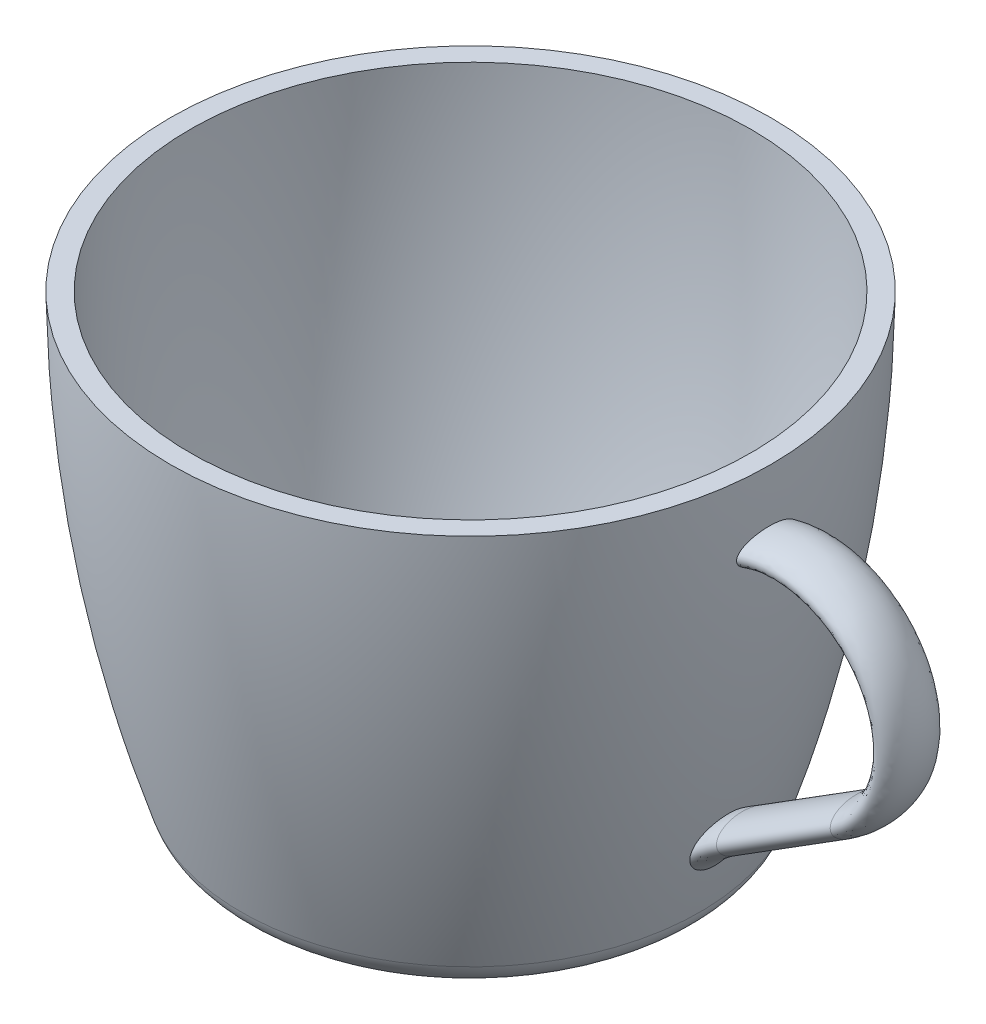
ISO-10303-21;
HEADER;
FILE_DESCRIPTION(('STEP AP214'),'2;1');
FILE_NAME('part.step','',(''),(''),'','','');
FILE_SCHEMA(('AUTOMOTIVE_DESIGN { 1 0 10303 214 1 1 1 1 }'));
ENDSEC;
DATA;
#1=APPLICATION_CONTEXT('core data for automotive mechanical design processes');
#2=APPLICATION_PROTOCOL_DEFINITION('international standard','automotive_design',2000,#1);
#3=PRODUCT_CONTEXT('',#1,'mechanical');
#4=PRODUCT('Part','Part','',(#3));
#5=PRODUCT_RELATED_PRODUCT_CATEGORY('part','',(#4));
#6=PRODUCT_DEFINITION_FORMATION('','',#4);
#7=PRODUCT_DEFINITION_CONTEXT('part definition',#1,'design');
#8=PRODUCT_DEFINITION('design','',#6,#7);
#9=PRODUCT_DEFINITION_SHAPE('','',#8);
#10=(LENGTH_UNIT() NAMED_UNIT(*) SI_UNIT(.MILLI.,.METRE.));
#11=(NAMED_UNIT(*) PLANE_ANGLE_UNIT() SI_UNIT($,.RADIAN.));
#12=(NAMED_UNIT(*) SI_UNIT($,.STERADIAN.) SOLID_ANGLE_UNIT());
#13=UNCERTAINTY_MEASURE_WITH_UNIT(LENGTH_MEASURE(1.E-05),#10,'distance_accuracy_value','');
#14=(GEOMETRIC_REPRESENTATION_CONTEXT(3) GLOBAL_UNCERTAINTY_ASSIGNED_CONTEXT((#13)) GLOBAL_UNIT_ASSIGNED_CONTEXT((#10,
#11,#12)) REPRESENTATION_CONTEXT('',''));
#15=CARTESIAN_POINT('',(0.,0.,0.));
#16=DIRECTION('',(0.,0.,1.));
#17=DIRECTION('',(1.,0.,0.));
#18=AXIS2_PLACEMENT_3D('',#15,#16,#17);
#19=CARTESIAN_POINT('',(0.,24.7080802430362,0.));
#20=DIRECTION('',(0.,-1.,0.));
#21=DIRECTION('',(0.,0.,-1.));
#22=AXIS2_PLACEMENT_3D('',#19,#20,#21);
#23=DEGENERATE_TOROIDAL_SURFACE('',#22,112.982951367078,143.,.F.);
#24=CARTESIAN_POINT('',(29.5676970278248,15.4879803064064,-3.));
#25=CARTESIAN_POINT('',(29.5646722833151,15.4413930119851,-2.99999347500467));
#26=CARTESIAN_POINT('',(29.5620379588384,15.3947247860376,-2.99586473990367));
#27=CARTESIAN_POINT('',(29.5576196413952,15.302744468671,-2.97958425291915));
#28=CARTESIAN_POINT('',(29.5558369873295,15.2574346168433,-2.96741993945269));
#29=CARTESIAN_POINT('',(29.5530905095124,15.169638050827,-2.93613071047937));
#30=CARTESIAN_POINT('',(29.5521213389152,15.1271346210882,-2.91705244587597));
#31=CARTESIAN_POINT('',(29.5508707472349,15.0452325327698,-2.87316929618347));
#32=CARTESIAN_POINT('',(29.5505895072274,15.0058346942767,-2.84836290523082));
#33=CARTESIAN_POINT('',(29.5505744102349,14.9047827300416,-2.77592680250168));
#34=CARTESIAN_POINT('',(29.5513386923821,14.8460734630384,-2.72419969958141));
#35=CARTESIAN_POINT('',(29.5538341250121,14.7371446110929,-2.61236780923148));
#36=CARTESIAN_POINT('',(29.5555693077515,14.6869615771577,-2.55222887295512));
#37=CARTESIAN_POINT('',(29.5593456388092,14.5995399590262,-2.43387485870161));
#38=CARTESIAN_POINT('',(29.5613272347704,14.5614738272851,-2.37625795624733));
#39=CARTESIAN_POINT('',(29.5655048965915,14.4904924058887,-2.25811129281611));
#40=CARTESIAN_POINT('',(29.5677005849127,14.4575683061623,-2.19758675161386));
#41=CARTESIAN_POINT('',(29.5721689645029,14.3960645764906,-2.07419306633094));
#42=CARTESIAN_POINT('',(29.5744418435629,14.3674966320324,-2.01131816032832));
#43=CARTESIAN_POINT('',(29.5789553299531,14.3142807891249,-1.88390962397263));
#44=CARTESIAN_POINT('',(29.5811959202585,14.2896348944839,-1.81937516517294));
#45=CARTESIAN_POINT('',(29.5875604603961,14.2229181893074,-1.62951285198764));
#46=CARTESIAN_POINT('',(29.5915340177925,14.1855101232157,-1.50253173681046));
#47=CARTESIAN_POINT('',(29.5987077727412,14.1214568400834,-1.24586224602552));
#48=CARTESIAN_POINT('',(29.6019074557455,14.0948187761417,-1.1161721311129));
#49=CARTESIAN_POINT('',(29.6073363920475,14.0510117052194,-0.854933639413126));
#50=CARTESIAN_POINT('',(29.6095637049861,14.0338616133857,-0.723382083005148));
#51=CARTESIAN_POINT('',(29.6129233924809,14.0083611388011,-0.459470882362938));
#52=CARTESIAN_POINT('',(29.6140560840368,14.0000082083512,-0.327111483258518));
#53=CARTESIAN_POINT('',(29.6152258319325,13.9913765300045,-0.0504204049962542));
#54=CARTESIAN_POINT('',(29.6151572960381,13.9918759785073,0.0939362924642104));
#55=CARTESIAN_POINT('',(29.6136661518723,14.0028934586276,0.382321850431675));
#56=CARTESIAN_POINT('',(29.6122430237262,14.0134153367233,0.5263505637886));
#57=CARTESIAN_POINT('',(29.6081221597564,14.0449908323278,0.81308864498302));
#58=CARTESIAN_POINT('',(29.605425777191,14.0660332696196,0.955799249952536));
#59=CARTESIAN_POINT('',(29.5989278636082,14.119738963004,1.23895351705578));
#60=CARTESIAN_POINT('',(29.5951272178649,14.1523929149665,1.37939890036083));
#61=CARTESIAN_POINT('',(29.5886630285339,14.2132164433989,1.59298488740369));
#62=CARTESIAN_POINT('',(29.5862752688587,14.2365974206366,1.66750801292362));
#63=CARTESIAN_POINT('',(29.581352626978,14.2878198890949,1.81499061236483));
#64=CARTESIAN_POINT('',(29.5788177957126,14.3156598417012,1.88795061584686));
#65=CARTESIAN_POINT('',(29.5737205395251,14.3762882661332,2.03149291454271));
#66=CARTESIAN_POINT('',(29.5711582475447,14.4090584779543,2.10208285433281));
#67=CARTESIAN_POINT('',(29.5661561785859,14.4803598187855,2.24026174571965));
#68=CARTESIAN_POINT('',(29.563716299058,14.5188860143987,2.30785320356433));
#69=CARTESIAN_POINT('',(29.5593600881766,14.5994714024441,2.43374819746498));
#70=CARTESIAN_POINT('',(29.5574179193606,14.6410307527736,2.49236622696259));
#71=CARTESIAN_POINT('',(29.5540884745892,14.7308701554476,2.60445687051399));
#72=CARTESIAN_POINT('',(29.5527020989816,14.7791609431202,2.65792103010208));
#73=CARTESIAN_POINT('',(29.5508446462943,14.8842116626752,2.75790589473511));
#74=CARTESIAN_POINT('',(29.5503881426998,14.9410916519095,2.80430565312633));
#75=CARTESIAN_POINT('',(29.5507994644105,15.0322985423586,2.86479300564279));
#76=CARTESIAN_POINT('',(29.5511180743833,15.0636353046105,2.88341754027651));
#77=CARTESIAN_POINT('',(29.5521825372189,15.1281601176925,2.91707711412985));
#78=CARTESIAN_POINT('',(29.5529280471575,15.1613466633196,2.9321150207327));
#79=CARTESIAN_POINT('',(29.5551593064393,15.2382008538669,2.96139834727733));
#80=CARTESIAN_POINT('',(29.5567873652999,15.2823454669821,2.97441518842387));
#81=CARTESIAN_POINT('',(29.560863323466,15.3721506868468,2.99282313281943));
#82=CARTESIAN_POINT('',(29.5633106916007,15.4178102941685,2.99821916495819));
#83=CARTESIAN_POINT('',(29.5689865668202,15.5093599457868,3.00103201710109));
#84=CARTESIAN_POINT('',(29.5722156448116,15.5552501343871,2.99844298907379));
#85=CARTESIAN_POINT('',(29.5793231511552,15.6459024395874,2.98566461717814));
#86=CARTESIAN_POINT('',(29.583202035633,15.6906637382019,2.97546991709912));
#87=CARTESIAN_POINT('',(29.5925223781922,15.7896213472358,2.94483127598959));
#88=CARTESIAN_POINT('',(29.5981057437856,15.8431809652134,2.92238938178227));
#89=CARTESIAN_POINT('',(29.6096878560013,15.9459164473821,2.86914978019951));
#90=CARTESIAN_POINT('',(29.6156874444777,15.9950829379443,2.8383347473181));
#91=CARTESIAN_POINT('',(29.630952463179,16.1129121907255,2.75298994238722));
#92=CARTESIAN_POINT('',(29.6403114202263,16.1786059268869,2.69441213609493));
#93=CARTESIAN_POINT('',(29.6587768066822,16.3003282013356,2.56804002878115));
#94=CARTESIAN_POINT('',(29.6678827463395,16.3563389607245,2.5002291744676));
#95=CARTESIAN_POINT('',(29.6843045492524,16.4527499733888,2.36832887520475));
#96=CARTESIAN_POINT('',(29.6916934307607,16.4942378941767,2.30502959969608));
#97=CARTESIAN_POINT('',(29.7059444785722,16.571718081227,2.17508034837354));
#98=CARTESIAN_POINT('',(29.7128063327847,16.6077071034863,2.10842842528857));
#99=CARTESIAN_POINT('',(29.7286400483933,16.6886427646486,1.94457253145746));
#100=CARTESIAN_POINT('',(29.7373111305488,16.7311398243536,1.84613166706394));
#101=CARTESIAN_POINT('',(29.753325606647,16.8076041230412,1.64587524570078));
#102=CARTESIAN_POINT('',(29.7606680841252,16.8415654803751,1.54405741617311));
#103=CARTESIAN_POINT('',(29.7758060626793,16.9102662536547,1.30932618521424));
#104=CARTESIAN_POINT('',(29.7831550604662,16.9425724246865,1.17567226328003));
#105=CARTESIAN_POINT('',(29.7954764144929,16.995961673264,0.905921725077907));
#106=CARTESIAN_POINT('',(29.8004459983006,17.0170316619335,0.769822450105882));
#107=CARTESIAN_POINT('',(29.8079946249586,17.0488118643221,0.494885451549243));
#108=CARTESIAN_POINT('',(29.8105474710723,17.0594086040761,0.356034012037504));
#109=CARTESIAN_POINT('',(29.8131506289004,17.0702130997085,0.0778304826705672));
#110=CARTESIAN_POINT('',(29.8131995157516,17.0704149404312,-0.0615218471129423));
#111=CARTESIAN_POINT('',(29.8107922106274,17.0604253612404,-0.339728857432147));
#112=CARTESIAN_POINT('',(29.8083378718171,17.0502416298794,-0.478583829853054));
#113=CARTESIAN_POINT('',(29.8009467957421,17.0191538702516,-0.754956660087094));
#114=CARTESIAN_POINT('',(29.7960118238729,16.9982574656773,-0.892475398013819));
#115=CARTESIAN_POINT('',(29.786056023006,16.9551557366798,-1.11310986378134));
#116=CARTESIAN_POINT('',(29.7817864689749,16.9364923004234,-1.19696196424548));
#117=CARTESIAN_POINT('',(29.7723400675315,16.8945160604558,-1.3633440134956));
#118=CARTESIAN_POINT('',(29.7671643590781,16.8712090882597,-1.44587548173547));
#119=CARTESIAN_POINT('',(29.7559194781808,16.8195210831347,-1.60943023815226));
#120=CARTESIAN_POINT('',(29.7498488501039,16.7911317670715,-1.6904508222638));
#121=CARTESIAN_POINT('',(29.7368602826289,16.7288122602673,-1.85027655489544));
#122=CARTESIAN_POINT('',(29.7299424700233,16.6948828984165,-1.92908203277078));
#123=CARTESIAN_POINT('',(29.717337734778,16.631039065945,-2.06236336492544));
#124=CARTESIAN_POINT('',(29.7118367634939,16.6025937275223,-2.1175606910496));
#125=CARTESIAN_POINT('',(29.70046056797,16.5421479513811,-2.22592657599595));
#126=CARTESIAN_POINT('',(29.694585461468,16.51014862974,-2.27909576471855));
#127=CARTESIAN_POINT('',(29.6825250895645,16.4422991434549,-2.38272066969652));
#128=CARTESIAN_POINT('',(29.6763405883508,16.4064582389907,-2.43318248990326));
#129=CARTESIAN_POINT('',(29.6637294836004,16.3304702921035,-2.53068703390513));
#130=CARTESIAN_POINT('',(29.6573030862129,16.2903268647872,-2.57773257325561));
#131=CARTESIAN_POINT('',(29.6443640529491,16.2055538163148,-2.666996683846));
#132=CARTESIAN_POINT('',(29.6378523672722,16.16095846732,-2.7092474806818));
#133=CARTESIAN_POINT('',(29.6248671141298,16.0666399390527,-2.78775540382967));
#134=CARTESIAN_POINT('',(29.6183935804402,16.0169127786068,-2.82400781907339));
#135=CARTESIAN_POINT('',(29.6056576857807,15.9114402119078,-2.88875374928772));
#136=CARTESIAN_POINT('',(29.5993996219217,15.8556194536343,-2.91712993070481));
#137=CARTESIAN_POINT('',(29.5905653336253,15.7686331653565,-2.9511229332888));
#138=CARTESIAN_POINT('',(29.5877163568612,15.7391393436675,-2.96101739881545));
#139=CARTESIAN_POINT('',(29.5822535605793,15.6792610563528,-2.97763894739098));
#140=CARTESIAN_POINT('',(29.5796395258004,15.6488774405415,-2.98436895424501));
#141=CARTESIAN_POINT('',(29.5754390883009,15.5967027606817,-2.99288058103276));
#142=CARTESIAN_POINT('',(29.5737790804091,15.5750581248191,-2.99554002937028));
#143=CARTESIAN_POINT('',(29.5706164629549,15.5316083847098,-2.99910158753801));
#144=CARTESIAN_POINT('',(29.5691139109809,15.5098032248517,-3.00000305650806));
#145=CARTESIAN_POINT('',(29.5676970278248,15.4879803064064,-3.));
#146=B_SPLINE_CURVE_WITH_KNOTS('',3,(#24,#25,#26,#27,#28,#29,#30,#31,#32,#33,#34,#35,#36,#37,
#38,#39,#40,#41,#42,#43,#44,#45,#46,#47,#48,#49,#50,#51,#52,#53,#54,#55,#56,#57,#58,#59,#60,#61,
#62,#63,#64,#65,#66,#67,#68,#69,#70,#71,#72,#73,#74,#75,#76,#77,#78,#79,#80,#81,#82,#83,#84,#85,
#86,#87,#88,#89,#90,#91,#92,#93,#94,#95,#96,#97,#98,#99,#100,#101,#102,#103,#104,#105,#106,#107,
#108,#109,#110,#111,#112,#113,#114,#115,#116,#117,#118,#119,#120,#121,#122,#123,#124,#125,#126,
#127,#128,#129,#130,#131,#132,#133,#134,#135,#136,#137,#138,#139,#140,#141,#142,#143,#144,#145),
.UNSPECIFIED.,.T.,.F.,(4,2,2,2,2,2,2,2,2,2,2,2,2,2,2,2,2,2,2,2,2,2,2,2,2,2,2,2,2,2,2,2,2,2,2,2,
2,2,2,2,2,2,2,2,2,2,2,2,2,2,2,2,2,2,2,2,2,2,2,2,4),(0.,0.139970521792622,0.280160371341673,
0.419421403776079,0.558719088220218,0.792120171621531,1.02649786808077,1.2334528908751,
1.44004934368447,1.64719059927977,1.85443734765623,2.25110789238997,2.64804146221855,
3.04576353007628,3.4433703840755,3.87609088640544,4.30897752818079,4.74140511524913,
5.17348698257659,5.40779741695436,5.64202717365734,5.87540985826388,6.10859364836367,
6.32383757511008,6.53942878714927,6.75837364914004,6.86754897629111,6.97663672681738,
7.11416281828852,7.25159992158879,7.38913770381803,7.52677243705431,7.70081872031015,
7.87522791524983,8.13928635493102,8.40382459803894,8.63163976429356,8.85958881248374,
9.18179555552028,9.50422371479059,9.91672878521011,10.329713333314,10.747124917178,
11.1647740240074,11.5821141649288,11.999157716448,12.2570695321836,12.5146594719865,
12.7726731149576,13.0306481897807,13.2175513479034,13.4043959768588,13.5907999341719,
13.7770484793263,13.9619600616173,14.1470161892481,14.3346968968841,14.4282721505082,
14.5217607744487,14.5873033738012,14.652869861827),.UNSPECIFIED.);
#147=CARTESIAN_POINT('',(29.5676970278248,15.4879803064064,-3.));
#148=VERTEX_POINT('',#147);
#149=EDGE_CURVE('E79',#148,#148,#146,.T.);
#150=ORIENTED_EDGE('',*,*,#149,.T.);
#151=EDGE_LOOP('',(#150));
#152=FACE_BOUND('',#151,.T.);
#153=CARTESIAN_POINT('',(24.9657021767809,-12.29982733705,-3.));
#154=CARTESIAN_POINT('',(24.9350345345137,-12.4134760592307,-2.99999646246255));
#155=CARTESIAN_POINT('',(24.9051905615634,-12.5273718634481,-2.99134197550601));
#156=CARTESIAN_POINT('',(24.8477211118185,-12.7532295546217,-2.95725053077125));
#157=CARTESIAN_POINT('',(24.8200972198492,-12.8651900160415,-2.93180170149655));
#158=CARTESIAN_POINT('',(24.7630618268586,-13.1032670236771,-2.85957219303458));
#159=CARTESIAN_POINT('',(24.7341183826207,-13.2286370827356,-2.80994543791396));
#160=CARTESIAN_POINT('',(24.6800458728877,-13.4707817829708,-2.69141413156365));
#161=CARTESIAN_POINT('',(24.6549188691458,-13.5875517607098,-2.62249921704464));
#162=CARTESIAN_POINT('',(24.6066544612833,-13.8189891649302,-2.46175111071961));
#163=CARTESIAN_POINT('',(24.5838315612476,-13.9327599760572,-2.36853644827809));
#164=CARTESIAN_POINT('',(24.5424350807943,-14.1454531993017,-2.16560335485954));
#165=CARTESIAN_POINT('',(24.5238633632383,-14.244369095513,-2.0558777235723));
#166=CARTESIAN_POINT('',(24.4981530748163,-14.3848809225125,-1.8752787996805));
#167=CARTESIAN_POINT('',(24.4896209553586,-14.4322968698483,-1.80903439660762));
#168=CARTESIAN_POINT('',(24.4737034815523,-14.5218977988554,-1.6729637078005));
#169=CARTESIAN_POINT('',(24.466318209844,-14.5640824035188,-1.60313716442376));
#170=CARTESIAN_POINT('',(24.445840571586,-14.682379600595,-1.38892494824104));
#171=CARTESIAN_POINT('',(24.4344167197756,-14.7502893479372,-1.23973731480481));
#172=CARTESIAN_POINT('',(24.4151876205229,-14.8662237096352,-0.921797338827574));
#173=CARTESIAN_POINT('',(24.4076887571595,-14.9125399138245,-0.752405797950164));
#174=CARTESIAN_POINT('',(24.3973753616429,-14.976619003147,-0.408151809491478));
#175=CARTESIAN_POINT('',(24.3945610359703,-14.9943806296778,-0.233289121104281));
#176=CARTESIAN_POINT('',(24.3935364461566,-15.0008212964253,0.117971250798729));
#177=CARTESIAN_POINT('',(24.3953520399501,-14.989336999696,0.294372047785685));
#178=CARTESIAN_POINT('',(24.4036923129447,-14.9373030963502,0.64270222047403));
#179=CARTESIAN_POINT('',(24.4102172147191,-14.8967521159723,0.814631384437286));
#180=CARTESIAN_POINT('',(24.4281534810872,-14.7877698480295,1.14919997628708));
#181=CARTESIAN_POINT('',(24.4395637387031,-14.7193448766324,1.31184149921363));
#182=CARTESIAN_POINT('',(24.4605175617565,-14.5974284336284,1.54521448491662));
#183=CARTESIAN_POINT('',(24.4681475526137,-14.5535448235358,1.62128239783381));
#184=CARTESIAN_POINT('',(24.4847250930653,-14.4596590657255,1.76939358767195));
#185=CARTESIAN_POINT('',(24.4936726309506,-14.4096569723841,1.84143690035208));
#186=CARTESIAN_POINT('',(24.5225761249629,-14.2509729909979,2.05036006585586));
#187=CARTESIAN_POINT('',(24.5446242525607,-14.133425557628,2.18039388322379));
#188=CARTESIAN_POINT('',(24.59476533783,-13.8775930827902,2.41685263098332));
#189=CARTESIAN_POINT('',(24.6228555135255,-13.7393175941143,2.52328838112378));
#190=CARTESIAN_POINT('',(24.6686328128695,-13.5243688281918,2.65821667244257));
#191=CARTESIAN_POINT('',(24.6838918220152,-13.4541126438789,2.69802874030228));
#192=CARTESIAN_POINT('',(24.7157663479911,-13.310472867904,2.77085869477862));
#193=CARTESIAN_POINT('',(24.7323811573876,-13.2370909166489,2.80388009338696));
#194=CARTESIAN_POINT('',(24.766925798989,-13.0877941873665,2.86262834560373));
#195=CARTESIAN_POINT('',(24.7848550183707,-13.0118805985625,2.88835857172441));
#196=CARTESIAN_POINT('',(24.8219458940308,-12.8581865771247,2.93211330531708));
#197=CARTESIAN_POINT('',(24.8411074005692,-12.7804063720282,2.95013874700048));
#198=CARTESIAN_POINT('',(24.8959455467507,-12.5625341281959,2.98901928422886));
#199=CARTESIAN_POINT('',(24.9328643482279,-12.4210799337561,3.0011493087873));
#200=CARTESIAN_POINT('',(25.009184870884,-12.1391932609717,2.99867794081787));
#201=CARTESIAN_POINT('',(25.0485852512228,-11.9987602758373,2.98409086636976));
#202=CARTESIAN_POINT('',(25.1254879839079,-11.7336590606725,2.93068913538003));
#203=CARTESIAN_POINT('',(25.1629167279981,-11.6085911046935,2.89373578658115));
#204=CARTESIAN_POINT('',(25.2373509044623,-11.3666470972783,2.79872670227883));
#205=CARTESIAN_POINT('',(25.2743563401037,-11.249770982578,2.74067112976529));
#206=CARTESIAN_POINT('',(25.3470377880501,-11.0256683692752,2.60499215547821));
#207=CARTESIAN_POINT('',(25.382694435092,-10.9185636618795,2.52715828570561));
#208=CARTESIAN_POINT('',(25.451045980996,-10.7174209420049,2.35508782396665));
#209=CARTESIAN_POINT('',(25.4837400111391,-10.6233867578677,2.2608464443889));
#210=CARTESIAN_POINT('',(25.5478479843319,-10.4420801938916,2.05015228149089));
#211=CARTESIAN_POINT('',(25.5789057428367,-10.3560990599782,1.93248264234646));
#212=CARTESIAN_POINT('',(25.6354232673702,-10.2018156312965,1.68487831217168));
#213=CARTESIAN_POINT('',(25.660880484122,-10.1335213848204,1.55493807406444));
#214=CARTESIAN_POINT('',(25.7082440146384,-10.0077313704278,1.26975254578274));
#215=CARTESIAN_POINT('',(25.7293438454122,-9.95255366317838,1.1133504149228));
#216=CARTESIAN_POINT('',(25.763074178452,-9.864909890376,0.793432210582464));
#217=CARTESIAN_POINT('',(25.7757004355697,-9.83245520840624,0.629912614962771));
#218=CARTESIAN_POINT('',(25.7930410136466,-9.78796227016745,0.281861625973422));
#219=CARTESIAN_POINT('',(25.7967666028546,-9.77847394927817,0.0969509476681655));
#220=CARTESIAN_POINT('',(25.7933314591209,-9.78725626830056,-0.272170803037643));
#221=CARTESIAN_POINT('',(25.7861662689711,-9.80553827361577,-0.456381558048579));
#222=CARTESIAN_POINT('',(25.7606375213838,-9.87125778181625,-0.826650050375181));
#223=CARTESIAN_POINT('',(25.7418248700598,-9.91986515529394,-1.01247134288171));
#224=CARTESIAN_POINT('',(25.6932153039317,-10.047423144843,-1.37211728185645));
#225=CARTESIAN_POINT('',(25.6634196947584,-10.1263701542501,-1.54594335137655));
#226=CARTESIAN_POINT('',(25.6124130206381,-10.2645126173235,-1.78780805170939));
#227=CARTESIAN_POINT('',(25.594937631104,-10.3122340225761,-1.86337225283322));
#228=CARTESIAN_POINT('',(25.5580084533481,-10.4142062788172,-2.00942076169233));
#229=CARTESIAN_POINT('',(25.5385558243332,-10.4684533073777,-2.07990800497422));
#230=CARTESIAN_POINT('',(25.4979024283519,-10.5832559238488,-2.21495214564248));
#231=CARTESIAN_POINT('',(25.4767023034105,-10.6438091969981,-2.27951120276142));
#232=CARTESIAN_POINT('',(25.4328216993636,-10.7709202657643,-2.40186262616368));
#233=CARTESIAN_POINT('',(25.4101414936783,-10.8374769532139,-2.45965623677021));
#234=CARTESIAN_POINT('',(25.3665298212017,-10.96746442121,-2.5608648361574));
#235=CARTESIAN_POINT('',(25.3457342252181,-11.0302456991172,-2.60517412596184));
#236=CARTESIAN_POINT('',(25.3034943148539,-11.1596512859278,-2.68740258989151));
#237=CARTESIAN_POINT('',(25.2820501147264,-11.226274919845,-2.72532288180905));
#238=CARTESIAN_POINT('',(25.2388003215846,-11.3627789316807,-2.79422189634398));
#239=CARTESIAN_POINT('',(25.2169953256277,-11.4326542200572,-2.82521105365044));
#240=CARTESIAN_POINT('',(25.1732702716671,-11.575135518324,-2.87988846347301));
#241=CARTESIAN_POINT('',(25.1513502562298,-11.6477405719335,-2.90357924647498));
#242=CARTESIAN_POINT('',(25.1016137358392,-11.8154162219987,-2.94884318471623));
#243=CARTESIAN_POINT('',(25.0738395865169,-11.9111565240207,-2.96802718688973));
#244=CARTESIAN_POINT('',(25.0190747368007,-12.1044799395909,-2.99360427981878));
#245=CARTESIAN_POINT('',(24.9920836941988,-12.2020622164835,-3.00000304312946));
#246=CARTESIAN_POINT('',(24.9657021767809,-12.29982733705,-3.));
#247=B_SPLINE_CURVE_WITH_KNOTS('',3,(#153,#154,#155,#156,#157,#158,#159,#160,#161,#162,#163,
#164,#165,#166,#167,#168,#169,#170,#171,#172,#173,#174,#175,#176,#177,#178,#179,#180,#181,#182,
#183,#184,#185,#186,#187,#188,#189,#190,#191,#192,#193,#194,#195,#196,#197,#198,#199,#200,#201,
#202,#203,#204,#205,#206,#207,#208,#209,#210,#211,#212,#213,#214,#215,#216,#217,#218,#219,#220,
#221,#222,#223,#224,#225,#226,#227,#228,#229,#230,#231,#232,#233,#234,#235,#236,#237,#238,#239,
#240,#241,#242,#243,#244,#245,#246),.UNSPECIFIED.,.T.,.F.,(4,2,2,2,2,2,2,2,2,2,2,2,2,2,2,2,2,2,
2,2,2,2,2,2,2,2,2,2,2,2,2,2,2,2,2,2,2,2,2,2,2,2,2,2,2,2,4),(0.,0.352871631403765,
0.705992966418844,1.11790410776586,1.53003699013379,1.97476349351121,2.41968450389263,
2.66518842270816,2.91071002401491,3.40149125953309,3.92635454707639,4.45124096842775,
4.97906527412615,5.50691452771451,6.03464423862379,6.29882139613582,6.56299620602066,
7.09013831561761,7.617038227637,7.86329388279332,8.10942185760458,8.35543580005443,
8.60141990464496,9.03893593598154,9.47621756475213,9.88132952260448,10.2864383515089,
10.6960531557157,11.105787683963,11.5510133754428,11.9964413091318,12.4959540762925,
12.9957169062974,13.5488411617752,14.1021918522727,14.6783345212025,15.2544087215867,
15.5272802784189,15.7999927701444,16.072605510881,16.3451680327437,16.583654335018,
16.8220988693029,17.0601819768421,17.2981824432711,17.601871331606,17.9054254493002),.UNSPECIFIED.);
#248=CARTESIAN_POINT('',(24.9657021767809,-12.29982733705,-3.));
#249=VERTEX_POINT('',#248);
#250=EDGE_CURVE('E64',#249,#249,#247,.T.);
#251=ORIENTED_EDGE('',*,*,#250,.T.);
#252=EDGE_LOOP('',(#251));
#253=FACE_BOUND('',#252,.T.);
#254=CARTESIAN_POINT('',(0.,-19.7433979926054,0.));
#255=DIRECTION('',(0.,-1.,0.));
#256=DIRECTION('',(0.,0.,-1.));
#257=AXIS2_PLACEMENT_3D('',#254,#255,#256);
#258=CIRCLE('',#257,22.9327066075136);
#259=CARTESIAN_POINT('',(0.,-19.7433979926054,-22.9327066075136));
#260=VERTEX_POINT('',#259);
#261=EDGE_CURVE('E10',#260,#260,#258,.T.);
#262=ORIENTED_EDGE('',*,*,#261,.F.);
#263=EDGE_LOOP('',(#262));
#264=FACE_BOUND('',#263,.T.);
#265=CARTESIAN_POINT('',(0.,22.5,0.));
#266=DIRECTION('',(0.,-1.,0.));
#267=DIRECTION('',(0.,0.,-1.));
#268=AXIS2_PLACEMENT_3D('',#265,#266,#267);
#269=CIRCLE('',#268,30.);
#270=CARTESIAN_POINT('',(0.,22.5,-30.));
#271=VERTEX_POINT('',#270);
#272=EDGE_CURVE('E51',#271,#271,#269,.T.);
#273=ORIENTED_EDGE('',*,*,#272,.T.);
#274=EDGE_LOOP('',(#273));
#275=FACE_BOUND('',#274,.T.);
#276=ADVANCED_FACE('F39',(#152,#253,#264,#275),#23,.F.);
#277=CARTESIAN_POINT('',(0.,-18.5,0.));
#278=DIRECTION('',(0.,-1.,0.));
#279=DIRECTION('',(0.,0.,-1.));
#280=AXIS2_PLACEMENT_3D('',#277,#278,#279);
#281=TOROIDAL_SURFACE('',#280,19.1308700208117,4.);
#282=CARTESIAN_POINT('',(0.,-22.5,0.));
#283=DIRECTION('',(0.,-1.,0.));
#284=DIRECTION('',(0.,0.,-1.));
#285=AXIS2_PLACEMENT_3D('',#282,#283,#284);
#286=CIRCLE('',#285,19.1308700208117);
#287=CARTESIAN_POINT('',(0.,-22.5,-19.1308700208117));
#288=VERTEX_POINT('',#287);
#289=EDGE_CURVE('E46',#288,#288,#286,.T.);
#290=ORIENTED_EDGE('',*,*,#289,.F.);
#291=EDGE_LOOP('',(#290));
#292=FACE_BOUND('',#291,.T.);
#293=ORIENTED_EDGE('',*,*,#261,.T.);
#294=EDGE_LOOP('',(#293));
#295=FACE_BOUND('',#294,.T.);
#296=ADVANCED_FACE('F111',(#292,#295),#281,.T.);
#297=CARTESIAN_POINT('',(-19.1308700208117,-22.5,0.));
#298=DIRECTION('',(0.,1.,0.));
#299=DIRECTION('',(0.,0.,1.));
#300=AXIS2_PLACEMENT_3D('',#297,#298,#299);
#301=PLANE('',#300);
#302=ORIENTED_EDGE('',*,*,#289,.T.);
#303=EDGE_LOOP('',(#302));
#304=FACE_BOUND('',#303,.T.);
#305=ADVANCED_FACE('F108',(#304),#301,.F.);
#306=CARTESIAN_POINT('',(-30.,22.5,0.));
#307=DIRECTION('',(0.,-1.,0.));
#308=DIRECTION('',(0.,0.,-1.));
#309=AXIS2_PLACEMENT_3D('',#306,#307,#308);
#310=PLANE('',#309);
#311=CARTESIAN_POINT('',(0.,22.5,0.));
#312=DIRECTION('',(0.,-1.,0.));
#313=DIRECTION('',(0.,0.,-1.));
#314=AXIS2_PLACEMENT_3D('',#311,#312,#313);
#315=CIRCLE('',#314,27.999758145969);
#316=CARTESIAN_POINT('',(0.,22.5,-27.999758145969));
#317=VERTEX_POINT('',#316);
#318=EDGE_CURVE('E59',#317,#317,#315,.T.);
#319=ORIENTED_EDGE('',*,*,#318,.T.);
#320=EDGE_LOOP('',(#319));
#321=FACE_BOUND('',#320,.T.);
#322=ORIENTED_EDGE('',*,*,#272,.F.);
#323=EDGE_LOOP('',(#322));
#324=FACE_BOUND('',#323,.T.);
#325=ADVANCED_FACE('F97',(#321,#324),#310,.F.);
#326=CARTESIAN_POINT('',(0.,24.7080802430362,0.));
#327=DIRECTION('',(0.,-1.,0.));
#328=DIRECTION('',(0.,0.,-1.));
#329=AXIS2_PLACEMENT_3D('',#326,#327,#328);
#330=DEGENERATE_TOROIDAL_SURFACE('',#329,112.982951367078,141.,.F.);
#331=CARTESIAN_POINT('',(0.,-19.1216989963027,0.));
#332=DIRECTION('',(0.,-1.,0.));
#333=DIRECTION('',(0.,0.,-1.));
#334=AXIS2_PLACEMENT_3D('',#331,#332,#333);
#335=CIRCLE('',#334,21.0317883141627);
#336=CARTESIAN_POINT('',(0.,-19.1216989963027,-21.0317883141627));
#337=VERTEX_POINT('',#336);
#338=EDGE_CURVE('E56',#337,#337,#335,.T.);
#339=ORIENTED_EDGE('',*,*,#338,.T.);
#340=EDGE_LOOP('',(#339));
#341=FACE_BOUND('',#340,.T.);
#342=ORIENTED_EDGE('',*,*,#318,.F.);
#343=EDGE_LOOP('',(#342));
#344=FACE_BOUND('',#343,.T.);
#345=ADVANCED_FACE('F93',(#341,#344),#330,.T.);
#346=CARTESIAN_POINT('',(0.,-18.5,0.));
#347=DIRECTION('',(0.,-1.,0.));
#348=DIRECTION('',(0.,0.,-1.));
#349=AXIS2_PLACEMENT_3D('',#346,#347,#348);
#350=TOROIDAL_SURFACE('',#349,19.1308700208117,2.);
#351=CARTESIAN_POINT('',(0.,-20.5,0.));
#352=DIRECTION('',(0.,-1.,0.));
#353=DIRECTION('',(0.,0.,-1.));
#354=AXIS2_PLACEMENT_3D('',#351,#352,#353);
#355=CIRCLE('',#354,19.1308700208117);
#356=CARTESIAN_POINT('',(0.,-20.5,-19.1308700208117));
#357=VERTEX_POINT('',#356);
#358=EDGE_CURVE('E63',#357,#357,#355,.T.);
#359=ORIENTED_EDGE('',*,*,#358,.T.);
#360=EDGE_LOOP('',(#359));
#361=FACE_BOUND('',#360,.T.);
#362=ORIENTED_EDGE('',*,*,#338,.F.);
#363=EDGE_LOOP('',(#362));
#364=FACE_BOUND('',#363,.T.);
#365=ADVANCED_FACE('F96',(#361,#364),#350,.F.);
#366=CARTESIAN_POINT('',(-19.1308700208117,-20.5,0.));
#367=DIRECTION('',(0.,1.,0.));
#368=DIRECTION('',(0.,0.,1.));
#369=AXIS2_PLACEMENT_3D('',#366,#367,#368);
#370=PLANE('',#369);
#371=ORIENTED_EDGE('',*,*,#358,.F.);
#372=EDGE_LOOP('',(#371));
#373=FACE_BOUND('',#372,.T.);
#374=ADVANCED_FACE('F101',(#373),#370,.T.);
#375=CARTESIAN_POINT('',(21.0931798368328,-17.0008428975491,-3.));
#376=CARTESIAN_POINT('',(21.5257188970478,-16.4122597403927,-3.));
#377=CARTESIAN_POINT('',(21.9604379131132,-15.8219378836681,-3.));
#378=CARTESIAN_POINT('',(22.8213066379113,-14.6480441518631,-3.));
#379=CARTESIAN_POINT('',(23.284248571875,-14.0281513578789,-3.));
#380=CARTESIAN_POINT('',(24.3840218750704,-12.824564478208,-3.));
#381=CARTESIAN_POINT('',(24.9714826813601,-12.2677383779796,-3.));
#382=CARTESIAN_POINT('',(25.914502652156,-11.4978901696524,-3.));
#383=CARTESIAN_POINT('',(26.2381457486019,-11.2528610583419,-3.));
#384=CARTESIAN_POINT('',(26.7360452445009,-10.9040901827174,-3.));
#385=CARTESIAN_POINT('',(26.9040846213845,-10.7909629880966,-3.));
#386=CARTESIAN_POINT('',(27.1590659521829,-10.626149993783,-3.));
#387=CARTESIAN_POINT('',(27.2445467902185,-10.572025360471,-3.));
#388=CARTESIAN_POINT('',(27.4164515786674,-10.4654334882947,-3.));
#389=CARTESIAN_POINT('',(27.5073763397794,-10.4116132635834,-3.));
#390=CARTESIAN_POINT('',(27.5897555736483,-10.3613436490929,-3.));
#391=CARTESIAN_POINT('',(22.9519504934159,-19.3556192449387,-3.));
#392=CARTESIAN_POINT('',(23.3844895536512,-18.7670360877645,-3.));
#393=CARTESIAN_POINT('',(23.8149167633955,-18.180102036677,-3.));
#394=CARTESIAN_POINT('',(24.6843691007951,-16.9994326936335,-3.));
#395=CARTESIAN_POINT('',(25.0812932983765,-16.4357185127983,-3.));
#396=CARTESIAN_POINT('',(25.9139706965104,-15.4101039646448,-3.));
#397=CARTESIAN_POINT('',(26.3813348374519,-14.9198671268316,-3.));
#398=CARTESIAN_POINT('',(27.1254807974816,-14.2435958043093,-3.));
#399=CARTESIAN_POINT('',(27.3817154356433,-14.0273309649681,-3.));
#400=CARTESIAN_POINT('',(27.7763720704106,-13.7181759699913,-3.));
#401=CARTESIAN_POINT('',(27.9096413266281,-13.6176637157997,-3.));
#402=CARTESIAN_POINT('',(28.1118710641917,-13.4708833277343,-3.));
#403=CARTESIAN_POINT('',(28.1796686027779,-13.4226211314702,-3.));
#404=CARTESIAN_POINT('',(28.315997146203,-13.3274549462383,-3.));
#405=CARTESIAN_POINT('',(28.3800273411395,-13.2819039424594,-3.));
#406=CARTESIAN_POINT('',(28.4534049560566,-13.2343402979363,-3.));
#407=CARTESIAN_POINT('',(22.9519504934159,-19.3556192449387,3.));
#408=CARTESIAN_POINT('',(23.3844895536512,-18.7670360877645,3.));
#409=CARTESIAN_POINT('',(23.8149167633955,-18.180102036677,3.));
#410=CARTESIAN_POINT('',(24.6843691007951,-16.9994326936335,3.));
#411=CARTESIAN_POINT('',(25.0812932983765,-16.4357185127983,3.));
#412=CARTESIAN_POINT('',(25.9139706965104,-15.4101039646448,3.));
#413=CARTESIAN_POINT('',(26.3813348374519,-14.9198671268316,3.));
#414=CARTESIAN_POINT('',(27.1254807974816,-14.2435958043093,3.));
#415=CARTESIAN_POINT('',(27.3817154356433,-14.0273309649681,3.));
#416=CARTESIAN_POINT('',(27.7763720704106,-13.7181759699913,3.));
#417=CARTESIAN_POINT('',(27.9096413266281,-13.6176637157997,3.));
#418=CARTESIAN_POINT('',(28.1118710641917,-13.4708833277343,3.));
#419=CARTESIAN_POINT('',(28.1796686027779,-13.4226211314702,3.));
#420=CARTESIAN_POINT('',(28.315997146203,-13.3274549462383,3.));
#421=CARTESIAN_POINT('',(28.3800273411395,-13.2819039424594,3.));
#422=CARTESIAN_POINT('',(28.4534049560566,-13.2343402979363,3.));
#423=CARTESIAN_POINT('',(21.0931798368328,-17.0008428975491,3.));
#424=CARTESIAN_POINT('',(21.5257188970478,-16.4122597403927,3.));
#425=CARTESIAN_POINT('',(21.9604379131132,-15.8219378836681,3.));
#426=CARTESIAN_POINT('',(22.8213066379113,-14.6480441518631,3.));
#427=CARTESIAN_POINT('',(23.284248571875,-14.0281513578789,3.));
#428=CARTESIAN_POINT('',(24.3840218750704,-12.824564478208,3.));
#429=CARTESIAN_POINT('',(24.9714826813601,-12.2677383779796,3.));
#430=CARTESIAN_POINT('',(25.914502652156,-11.4978901696524,3.));
#431=CARTESIAN_POINT('',(26.2381457486019,-11.2528610583419,3.));
#432=CARTESIAN_POINT('',(26.7360452445009,-10.9040901827174,3.));
#433=CARTESIAN_POINT('',(26.9040846213845,-10.7909629880966,3.));
#434=CARTESIAN_POINT('',(27.1590659521829,-10.626149993783,3.));
#435=CARTESIAN_POINT('',(27.2445467902185,-10.572025360471,3.));
#436=CARTESIAN_POINT('',(27.4164515786674,-10.4654334882947,3.));
#437=CARTESIAN_POINT('',(27.5073763397794,-10.4116132635834,3.));
#438=CARTESIAN_POINT('',(27.5897555736483,-10.3613436490929,3.));
#439=CARTESIAN_POINT('',(19.2344091802497,-14.6460665501595,3.));
#440=CARTESIAN_POINT('',(19.6669482404444,-14.0574833930208,3.));
#441=CARTESIAN_POINT('',(20.1059590628308,-13.4637737306592,3.));
#442=CARTESIAN_POINT('',(20.9582441750274,-12.2966556100928,3.));
#443=CARTESIAN_POINT('',(21.4872038453735,-11.6205842029595,3.));
#444=CARTESIAN_POINT('',(22.8540730536304,-10.2390249917711,3.));
#445=CARTESIAN_POINT('',(23.5616305252683,-9.61560962912753,3.));
#446=CARTESIAN_POINT('',(24.7035245068304,-8.75218453499551,3.));
#447=CARTESIAN_POINT('',(25.0945760615605,-8.47839115171569,3.));
#448=CARTESIAN_POINT('',(25.6957184185914,-8.09000439544347,3.));
#449=CARTESIAN_POINT('',(25.898527916141,-7.96426226039353,3.));
#450=CARTESIAN_POINT('',(26.2062608401741,-7.78141665983176,3.));
#451=CARTESIAN_POINT('',(26.3094249776591,-7.72142958947172,3.));
#452=CARTESIAN_POINT('',(26.5169060111318,-7.60341203035101,3.));
#453=CARTESIAN_POINT('',(26.6347253384193,-7.54132258470745,3.));
#454=CARTESIAN_POINT('',(26.72610619124,-7.4883470002494,3.));
#455=CARTESIAN_POINT('',(19.2344091802497,-14.6460665501595,-3.));
#456=CARTESIAN_POINT('',(19.6669482404444,-14.0574833930208,-3.));
#457=CARTESIAN_POINT('',(20.1059590628308,-13.4637737306592,-3.));
#458=CARTESIAN_POINT('',(20.9582441750274,-12.2966556100928,-3.));
#459=CARTESIAN_POINT('',(21.4872038453735,-11.6205842029595,-3.));
#460=CARTESIAN_POINT('',(22.8540730536304,-10.2390249917711,-3.));
#461=CARTESIAN_POINT('',(23.5616305252683,-9.61560962912753,-3.));
#462=CARTESIAN_POINT('',(24.7035245068304,-8.75218453499551,-3.));
#463=CARTESIAN_POINT('',(25.0945760615605,-8.47839115171569,-3.));
#464=CARTESIAN_POINT('',(25.6957184185914,-8.09000439544347,-3.));
#465=CARTESIAN_POINT('',(25.898527916141,-7.96426226039353,-3.));
#466=CARTESIAN_POINT('',(26.2062608401741,-7.78141665983176,-3.));
#467=CARTESIAN_POINT('',(26.3094249776591,-7.72142958947172,-3.));
#468=CARTESIAN_POINT('',(26.5169060111318,-7.60341203035101,-3.));
#469=CARTESIAN_POINT('',(26.6347253384193,-7.54132258470745,-3.));
#470=CARTESIAN_POINT('',(26.72610619124,-7.4883470002494,-3.));
#471=CARTESIAN_POINT('',(21.0931798368328,-17.0008428975491,-3.));
#472=CARTESIAN_POINT('',(21.5257188970478,-16.4122597403927,-3.));
#473=CARTESIAN_POINT('',(21.9604379131132,-15.8219378836681,-3.));
#474=CARTESIAN_POINT('',(22.8213066379113,-14.6480441518631,-3.));
#475=CARTESIAN_POINT('',(23.284248571875,-14.0281513578789,-3.));
#476=CARTESIAN_POINT('',(24.3840218750704,-12.824564478208,-3.));
#477=CARTESIAN_POINT('',(24.9714826813601,-12.2677383779796,-3.));
#478=CARTESIAN_POINT('',(25.914502652156,-11.4978901696524,-3.));
#479=CARTESIAN_POINT('',(26.2381457486019,-11.2528610583419,-3.));
#480=CARTESIAN_POINT('',(26.7360452445009,-10.9040901827174,-3.));
#481=CARTESIAN_POINT('',(26.9040846213845,-10.7909629880966,-3.));
#482=CARTESIAN_POINT('',(27.1590659521829,-10.626149993783,-3.));
#483=CARTESIAN_POINT('',(27.2445467902185,-10.572025360471,-3.));
#484=CARTESIAN_POINT('',(27.4164515786674,-10.4654334882947,-3.));
#485=CARTESIAN_POINT('',(27.5073763397794,-10.4116132635834,-3.));
#486=CARTESIAN_POINT('',(27.5897555736483,-10.3613436490929,-3.));
#487=(BOUNDED_SURFACE() B_SPLINE_SURFACE(3,3,((#375,#376,#377,#378,#379,#380,#381,#382,#383,
#384,#385,#386,#387,#388,#389,#390),(#391,#392,#393,#394,#395,#396,#397,#398,#399,#400,#401,
#402,#403,#404,#405,#406),(#407,#408,#409,#410,#411,#412,#413,#414,#415,#416,#417,#418,#419,
#420,#421,#422),(#423,#424,#425,#426,#427,#428,#429,#430,#431,#432,#433,#434,#435,#436,#437,
#438),(#439,#440,#441,#442,#443,#444,#445,#446,#447,#448,#449,#450,#451,#452,#453,#454),(#455,
#456,#457,#458,#459,#460,#461,#462,#463,#464,#465,#466,#467,#468,#469,#470),(#471,#472,#473,
#474,#475,#476,#477,#478,#479,#480,#481,#482,#483,#484,#485,#486)),.UNSPECIFIED.,.T.,.F.,
.F.) B_SPLINE_SURFACE_WITH_KNOTS((4,3,4),(4,2,2,2,2,2,2,4),(0.,0.5,1.),(0.,0.0380970021501662,
0.0761940043003324,0.114291006450499,0.133339507525582,0.142863758063123,0.147625883331894,
0.152388008600665),
.UNSPECIFIED.) GEOMETRIC_REPRESENTATION_ITEM() RATIONAL_B_SPLINE_SURFACE(((1.,1.,1.,1.,1.,1.,1.,
1.,1.,1.,1.,1.,1.,1.,1.,1.),(0.333333333333333,0.333333333333333,0.333333333333333,
0.333333333333333,0.333333333333333,0.333333333333333,0.333333333333333,0.333333333333333,
0.333333333333333,0.333333333333333,0.333333333333333,0.333333333333333,0.333333333333333,
0.333333333333333,0.333333333333333,0.333333333333333),(0.333333333333333,0.333333333333333,
0.333333333333333,0.333333333333333,0.333333333333333,0.333333333333333,0.333333333333333,
0.333333333333333,0.333333333333333,0.333333333333333,0.333333333333333,0.333333333333333,
0.333333333333333,0.333333333333333,0.333333333333333,0.333333333333333),(1.,1.,1.,1.,1.,1.,1.,
1.,1.,1.,1.,1.,1.,1.,1.,1.),(0.333333333333333,0.333333333333333,0.333333333333333,
0.333333333333333,0.333333333333333,0.333333333333333,0.333333333333333,0.333333333333333,
0.333333333333333,0.333333333333333,0.333333333333333,0.333333333333333,0.333333333333333,
0.333333333333333,0.333333333333333,0.333333333333333),(0.333333333333333,0.333333333333333,
0.333333333333333,0.333333333333333,0.333333333333333,0.333333333333333,0.333333333333333,
0.333333333333333,0.333333333333333,0.333333333333333,0.333333333333333,0.333333333333333,
0.333333333333333,0.333333333333333,0.333333333333333,0.333333333333333),(1.,1.,1.,1.,1.,1.,1.,
1.,1.,1.,1.,1.,1.,1.,1.,1.))) REPRESENTATION_ITEM('') SURFACE());
#488=CARTESIAN_POINT('',(27.5897555736483,-10.3613436490929,0.));
#489=DIRECTION('',(-0.957665549614487,-0.287883127469433,0.));
#490=DIRECTION('',(0.,0.,-1.));
#491=AXIS2_PLACEMENT_3D('',#488,#489,#490);
#492=ELLIPSE('',#491,3.,1.5);
#493=CARTESIAN_POINT('',(27.5897555736483,-10.3613436490929,-3.));
#494=VERTEX_POINT('',#493);
#495=EDGE_CURVE('E139',#494,#494,#492,.T.);
#496=ORIENTED_EDGE('',*,*,#495,.T.);
#497=EDGE_LOOP('',(#496));
#498=FACE_BOUND('',#497,.T.);
#499=ORIENTED_EDGE('',*,*,#250,.F.);
#500=EDGE_LOOP('',(#499));
#501=FACE_BOUND('',#500,.T.);
#502=ADVANCED_FACE('F86',(#498,#501),#487,.F.);
#503=CARTESIAN_POINT('',(38.9509110969145,-3.22522809676626,-3.));
#504=CARTESIAN_POINT('',(39.8121271049503,-2.63706981925657,-3.));
#505=CARTESIAN_POINT('',(40.6464672673348,-1.87837293076346,-3.));
#506=CARTESIAN_POINT('',(42.0670380431876,-0.0379165182638331,-3.));
#507=CARTESIAN_POINT('',(42.6624454214517,1.05262770146477,-3.));
#508=CARTESIAN_POINT('',(43.4344377038791,3.44452049777022,-3.));
#509=CARTESIAN_POINT('',(43.6188798774431,4.75958319752719,-3.));
#510=CARTESIAN_POINT('',(43.4722787635792,7.39576093958013,-3.));
#511=CARTESIAN_POINT('',(43.1451549492654,8.73504296134108,-3.));
#512=CARTESIAN_POINT('',(42.0036358584641,11.1809877417092,-3.));
#513=CARTESIAN_POINT('',(41.1867723844096,12.3077980412049,-3.));
#514=CARTESIAN_POINT('',(39.2229257746636,14.1366958598695,-3.));
#515=CARTESIAN_POINT('',(38.0669474184164,14.8575565094324,-3.));
#516=CARTESIAN_POINT('',(35.6600399754981,15.8011682383788,-3.));
#517=CARTESIAN_POINT('',(34.395814559221,16.0383680278851,-3.));
#518=CARTESIAN_POINT('',(32.5933540404115,16.070222551564,-3.));
#519=CARTESIAN_POINT('',(32.0043890148867,16.0292546331816,-3.));
#520=CARTESIAN_POINT('',(31.1542295244367,15.902303640643,-3.));
#521=CARTESIAN_POINT('',(30.8762960376892,15.8491114407481,-3.));
#522=CARTESIAN_POINT('',(30.3338460341801,15.7231625495461,-3.));
#523=CARTESIAN_POINT('',(30.0621216278889,15.6504179995156,-3.));
#524=CARTESIAN_POINT('',(29.4671148613578,15.4561054859953,-3.));
#525=CARTESIAN_POINT('',(28.935476772426,15.2744145161264,-3.));
#526=CARTESIAN_POINT('',(28.4786558000112,15.1231716639984,-3.));
#527=CARTESIAN_POINT('',(39.8145604793228,-6.09822474560972,-3.));
#528=CARTESIAN_POINT('',(40.9641090855167,-5.42339102078041,-3.));
#529=CARTESIAN_POINT('',(42.0803664764698,-4.53476567560346,-3.));
#530=CARTESIAN_POINT('',(44.0521607450097,-2.31207031233771,-3.));
#531=CARTESIAN_POINT('',(44.8936157022531,-0.985600984561033,-3.));
#532=CARTESIAN_POINT('',(46.0883019946184,1.99901021038648,-3.));
#533=CARTESIAN_POINT('',(46.4287647114782,3.64091699405042,-3.));
#534=CARTESIAN_POINT('',(46.4731462015577,7.01938265098028,-3.));
#535=CARTESIAN_POINT('',(46.1707042162912,8.73251017613296,-3.));
#536=CARTESIAN_POINT('',(44.9280668378282,11.9566538062233,-3.));
#537=CARTESIAN_POINT('',(43.9916496775322,13.4414124439875,-3.));
#538=CARTESIAN_POINT('',(41.6442473826043,15.9504268807733,-3.));
#539=CARTESIAN_POINT('',(40.2476897795562,16.9517211917822,-3.));
#540=CARTESIAN_POINT('',(37.2569871778175,18.3684477058748,-3.));
#541=CARTESIAN_POINT('',(35.6832152506713,18.7703272930207,-3.));
#542=CARTESIAN_POINT('',(33.3862770330503,18.9687608734276,-3.));
#543=CARTESIAN_POINT('',(32.6360034906852,18.9664557466329,-3.));
#544=CARTESIAN_POINT('',(31.5465896968587,18.8776314045543,-3.));
#545=CARTESIAN_POINT('',(31.1895461209857,18.8337541122784,-3.));
#546=CARTESIAN_POINT('',(30.4898770704739,18.7201396612179,-3.));
#547=CARTESIAN_POINT('',(30.154546864702,18.6504194577346,-3.));
#548=CARTESIAN_POINT('',(29.338910901285,18.4561034632853,-3.));
#549=CARTESIAN_POINT('',(28.773177418644,18.2700258051336,-3.));
#550=CARTESIAN_POINT('',(28.3216479312823,18.1190602682621,-3.));
#551=CARTESIAN_POINT('',(39.8145604793228,-6.09822474560972,3.));
#552=CARTESIAN_POINT('',(40.9641090855167,-5.42339102078041,3.));
#553=CARTESIAN_POINT('',(42.0803664764698,-4.53476567560346,3.));
#554=CARTESIAN_POINT('',(44.0521607450097,-2.31207031233771,3.));
#555=CARTESIAN_POINT('',(44.8936157022531,-0.985600984561033,3.));
#556=CARTESIAN_POINT('',(46.0883019946184,1.99901021038648,3.));
#557=CARTESIAN_POINT('',(46.4287647114782,3.64091699405042,3.));
#558=CARTESIAN_POINT('',(46.4731462015577,7.01938265098028,3.));
#559=CARTESIAN_POINT('',(46.1707042162912,8.73251017613296,3.));
#560=CARTESIAN_POINT('',(44.9280668378282,11.9566538062233,3.));
#561=CARTESIAN_POINT('',(43.9916496775322,13.4414124439875,3.));
#562=CARTESIAN_POINT('',(41.6442473826043,15.9504268807733,3.));
#563=CARTESIAN_POINT('',(40.2476897795562,16.9517211917822,3.));
#564=CARTESIAN_POINT('',(37.2569871778175,18.3684477058748,3.));
#565=CARTESIAN_POINT('',(35.6832152506713,18.7703272930207,3.));
#566=CARTESIAN_POINT('',(33.3862770330503,18.9687608734276,3.));
#567=CARTESIAN_POINT('',(32.6360034906852,18.9664557466329,3.));
#568=CARTESIAN_POINT('',(31.5465896968587,18.8776314045543,3.));
#569=CARTESIAN_POINT('',(31.1895461209857,18.8337541122784,3.));
#570=CARTESIAN_POINT('',(30.4898770704739,18.7201396612179,3.));
#571=CARTESIAN_POINT('',(30.154546864702,18.6504194577346,3.));
#572=CARTESIAN_POINT('',(29.338910901285,18.4561034632853,3.));
#573=CARTESIAN_POINT('',(28.773177418644,18.2700258051336,3.));
#574=CARTESIAN_POINT('',(28.3216479312823,18.1190602682621,3.));
#575=CARTESIAN_POINT('',(38.9509110969145,-3.22522809676626,3.));
#576=CARTESIAN_POINT('',(39.8121271049503,-2.63706981925657,3.));
#577=CARTESIAN_POINT('',(40.6464672673348,-1.87837293076346,3.));
#578=CARTESIAN_POINT('',(42.0670380431876,-0.0379165182638331,3.));
#579=CARTESIAN_POINT('',(42.6624454214517,1.05262770146477,3.));
#580=CARTESIAN_POINT('',(43.4344377038791,3.44452049777022,3.));
#581=CARTESIAN_POINT('',(43.6188798774431,4.75958319752719,3.));
#582=CARTESIAN_POINT('',(43.4722787635792,7.39576093958013,3.));
#583=CARTESIAN_POINT('',(43.1451549492654,8.73504296134108,3.));
#584=CARTESIAN_POINT('',(42.0036358584641,11.1809877417092,3.));
#585=CARTESIAN_POINT('',(41.1867723844096,12.3077980412049,3.));
#586=CARTESIAN_POINT('',(39.2229257746636,14.1366958598695,3.));
#587=CARTESIAN_POINT('',(38.0669474184164,14.8575565094324,3.));
#588=CARTESIAN_POINT('',(35.6600399754981,15.8011682383788,3.));
#589=CARTESIAN_POINT('',(34.395814559221,16.0383680278851,3.));
#590=CARTESIAN_POINT('',(32.5933540404115,16.070222551564,3.));
#591=CARTESIAN_POINT('',(32.0043890148867,16.0292546331816,3.));
#592=CARTESIAN_POINT('',(31.1542295244367,15.902303640643,3.));
#593=CARTESIAN_POINT('',(30.8762960376892,15.8491114407481,3.));
#594=CARTESIAN_POINT('',(30.3338460341801,15.7231625495461,3.));
#595=CARTESIAN_POINT('',(30.0621216278889,15.6504179995156,3.));
#596=CARTESIAN_POINT('',(29.4671148613578,15.4561054859953,3.));
#597=CARTESIAN_POINT('',(28.935476772426,15.2744145161264,3.));
#598=CARTESIAN_POINT('',(28.4786558000112,15.1231716639984,3.));
#599=CARTESIAN_POINT('',(38.0872617145062,-0.352231447922798,3.));
#600=CARTESIAN_POINT('',(38.6601451243839,0.149251382267284,3.));
#601=CARTESIAN_POINT('',(39.2125680581998,0.77801981407655,3.));
#602=CARTESIAN_POINT('',(40.0819153413656,2.23623727581005,3.));
#603=CARTESIAN_POINT('',(40.4312751406503,3.09085638749058,3.));
#604=CARTESIAN_POINT('',(40.7805734131399,4.89003078515397,3.));
#605=CARTESIAN_POINT('',(40.808995043408,5.87824940100397,3.));
#606=CARTESIAN_POINT('',(40.4714113256007,7.77213922817999,3.));
#607=CARTESIAN_POINT('',(40.1196056822396,8.73757574654921,3.));
#608=CARTESIAN_POINT('',(39.0792048791001,10.405321677195,3.));
#609=CARTESIAN_POINT('',(38.381895091287,11.1741836384224,3.));
#610=CARTESIAN_POINT('',(36.8016041667229,12.3229648389656,3.));
#611=CARTESIAN_POINT('',(35.8862050572766,12.7633918270826,3.));
#612=CARTESIAN_POINT('',(34.0630927731788,13.2338887708828,3.));
#613=CARTESIAN_POINT('',(33.1084138677708,13.3064087627495,3.));
#614=CARTESIAN_POINT('',(31.8004310477726,13.1716842297004,3.));
#615=CARTESIAN_POINT('',(31.3727745390882,13.0920535197303,3.));
#616=CARTESIAN_POINT('',(30.7618693520148,12.9269758767317,3.));
#617=CARTESIAN_POINT('',(30.5630459543926,12.8644687692177,3.));
#618=CARTESIAN_POINT('',(30.1778149978863,12.7261854378742,3.));
#619=CARTESIAN_POINT('',(29.9696963910758,12.6504165412966,3.));
#620=CARTESIAN_POINT('',(29.5953188214307,12.4561075087053,3.));
#621=CARTESIAN_POINT('',(29.0977761262079,12.2788032271191,3.));
#622=CARTESIAN_POINT('',(28.6356636687401,12.1272830597347,3.));
#623=CARTESIAN_POINT('',(38.0872617145062,-0.352231447922798,-3.));
#624=CARTESIAN_POINT('',(38.6601451243839,0.149251382267284,-3.));
#625=CARTESIAN_POINT('',(39.2125680581998,0.77801981407655,-3.));
#626=CARTESIAN_POINT('',(40.0819153413656,2.23623727581005,-3.));
#627=CARTESIAN_POINT('',(40.4312751406503,3.09085638749058,-3.));
#628=CARTESIAN_POINT('',(40.7805734131399,4.89003078515397,-3.));
#629=CARTESIAN_POINT('',(40.808995043408,5.87824940100397,-3.));
#630=CARTESIAN_POINT('',(40.4714113256007,7.77213922817999,-3.));
#631=CARTESIAN_POINT('',(40.1196056822396,8.73757574654921,-3.));
#632=CARTESIAN_POINT('',(39.0792048791001,10.405321677195,-3.));
#633=CARTESIAN_POINT('',(38.381895091287,11.1741836384224,-3.));
#634=CARTESIAN_POINT('',(36.8016041667229,12.3229648389656,-3.));
#635=CARTESIAN_POINT('',(35.8862050572766,12.7633918270826,-3.));
#636=CARTESIAN_POINT('',(34.0630927731788,13.2338887708828,-3.));
#637=CARTESIAN_POINT('',(33.1084138677708,13.3064087627495,-3.));
#638=CARTESIAN_POINT('',(31.8004310477726,13.1716842297004,-3.));
#639=CARTESIAN_POINT('',(31.3727745390882,13.0920535197303,-3.));
#640=CARTESIAN_POINT('',(30.7618693520148,12.9269758767317,-3.));
#641=CARTESIAN_POINT('',(30.5630459543926,12.8644687692177,-3.));
#642=CARTESIAN_POINT('',(30.1778149978863,12.7261854378742,-3.));
#643=CARTESIAN_POINT('',(29.9696963910758,12.6504165412966,-3.));
#644=CARTESIAN_POINT('',(29.5953188214307,12.4561075087053,-3.));
#645=CARTESIAN_POINT('',(29.0977761262079,12.2788032271191,-3.));
#646=CARTESIAN_POINT('',(28.6356636687401,12.1272830597347,-3.));
#647=CARTESIAN_POINT('',(38.9509110969145,-3.22522809676626,-3.));
#648=CARTESIAN_POINT('',(39.8121271049503,-2.63706981925657,-3.));
#649=CARTESIAN_POINT('',(40.6464672673348,-1.87837293076346,-3.));
#650=CARTESIAN_POINT('',(42.0670380431876,-0.0379165182638331,-3.));
#651=CARTESIAN_POINT('',(42.6624454214517,1.05262770146477,-3.));
#652=CARTESIAN_POINT('',(43.4344377038791,3.44452049777022,-3.));
#653=CARTESIAN_POINT('',(43.6188798774431,4.75958319752719,-3.));
#654=CARTESIAN_POINT('',(43.4722787635792,7.39576093958013,-3.));
#655=CARTESIAN_POINT('',(43.1451549492654,8.73504296134108,-3.));
#656=CARTESIAN_POINT('',(42.0036358584641,11.1809877417092,-3.));
#657=CARTESIAN_POINT('',(41.1867723844096,12.3077980412049,-3.));
#658=CARTESIAN_POINT('',(39.2229257746636,14.1366958598695,-3.));
#659=CARTESIAN_POINT('',(38.0669474184164,14.8575565094324,-3.));
#660=CARTESIAN_POINT('',(35.6600399754981,15.8011682383788,-3.));
#661=CARTESIAN_POINT('',(34.395814559221,16.0383680278851,-3.));
#662=CARTESIAN_POINT('',(32.5933540404115,16.070222551564,-3.));
#663=CARTESIAN_POINT('',(32.0043890148867,16.0292546331816,-3.));
#664=CARTESIAN_POINT('',(31.1542295244367,15.902303640643,-3.));
#665=CARTESIAN_POINT('',(30.8762960376892,15.8491114407481,-3.));
#666=CARTESIAN_POINT('',(30.3338460341801,15.7231625495461,-3.));
#667=CARTESIAN_POINT('',(30.0621216278889,15.6504179995156,-3.));
#668=CARTESIAN_POINT('',(29.4671148613578,15.4561054859953,-3.));
#669=CARTESIAN_POINT('',(28.935476772426,15.2744145161264,-3.));
#670=CARTESIAN_POINT('',(28.4786558000112,15.1231716639984,-3.));
#671=(BOUNDED_SURFACE() B_SPLINE_SURFACE(3,3,((#503,#504,#505,#506,#507,#508,#509,#510,#511,
#512,#513,#514,#515,#516,#517,#518,#519,#520,#521,#522,#523,#524,#525,#526),(#527,#528,#529,
#530,#531,#532,#533,#534,#535,#536,#537,#538,#539,#540,#541,#542,#543,#544,#545,#546,#547,#548,
#549,#550),(#551,#552,#553,#554,#555,#556,#557,#558,#559,#560,#561,#562,#563,#564,#565,#566,
#567,#568,#569,#570,#571,#572,#573,#574),(#575,#576,#577,#578,#579,#580,#581,#582,#583,#584,
#585,#586,#587,#588,#589,#590,#591,#592,#593,#594,#595,#596,#597,#598),(#599,#600,#601,#602,
#603,#604,#605,#606,#607,#608,#609,#610,#611,#612,#613,#614,#615,#616,#617,#618,#619,#620,#621,
#622),(#623,#624,#625,#626,#627,#628,#629,#630,#631,#632,#633,#634,#635,#636,#637,#638,#639,
#640,#641,#642,#643,#644,#645,#646),(#647,#648,#649,#650,#651,#652,#653,#654,#655,#656,#657,
#658,#659,#660,#661,#662,#663,#664,#665,#666,#667,#668,#669,#670)),.UNSPECIFIED.,.T.,.F.,
.F.) B_SPLINE_SURFACE_WITH_KNOTS((4,3,4),(4,2,2,2,2,2,2,2,2,2,2,4),(0.,0.5,1.),
(0.384031053474612,0.457828270251273,0.531625487027934,0.605422703804595,0.679219920581255,
0.753017137357916,0.826814354134577,0.900611570911237,0.937510179299568,0.955959483493733,
0.974408787687898,1.),
.UNSPECIFIED.) GEOMETRIC_REPRESENTATION_ITEM() RATIONAL_B_SPLINE_SURFACE(((1.,1.,1.,1.,1.,1.,1.,
1.,1.,1.,1.,1.,1.,1.,1.,1.,1.,1.,1.,1.,1.,1.,1.,1.),(0.333333333333333,0.333333333333333,
0.333333333333333,0.333333333333333,0.333333333333333,0.333333333333333,0.333333333333333,
0.333333333333333,0.333333333333333,0.333333333333333,0.333333333333333,0.333333333333333,
0.333333333333333,0.333333333333333,0.333333333333333,0.333333333333333,0.333333333333333,
0.333333333333333,0.333333333333333,0.333333333333333,0.333333333333333,0.333333333333333,
0.333333333333333,0.333333333333333),(0.333333333333333,0.333333333333333,0.333333333333333,
0.333333333333333,0.333333333333333,0.333333333333333,0.333333333333333,0.333333333333333,
0.333333333333333,0.333333333333333,0.333333333333333,0.333333333333333,0.333333333333333,
0.333333333333333,0.333333333333333,0.333333333333333,0.333333333333333,0.333333333333333,
0.333333333333333,0.333333333333333,0.333333333333333,0.333333333333333,0.333333333333333,
0.333333333333333),(1.,1.,1.,1.,1.,1.,1.,1.,1.,1.,1.,1.,1.,1.,1.,1.,1.,1.,1.,1.,1.,1.,1.,1.),
(0.333333333333333,0.333333333333333,0.333333333333333,0.333333333333333,0.333333333333333,
0.333333333333333,0.333333333333333,0.333333333333333,0.333333333333333,0.333333333333333,
0.333333333333333,0.333333333333333,0.333333333333333,0.333333333333333,0.333333333333333,
0.333333333333333,0.333333333333333,0.333333333333333,0.333333333333333,0.333333333333333,
0.333333333333333,0.333333333333333,0.333333333333333,0.333333333333333),(0.333333333333333,
0.333333333333333,0.333333333333333,0.333333333333333,0.333333333333333,0.333333333333333,
0.333333333333333,0.333333333333333,0.333333333333333,0.333333333333333,0.333333333333333,
0.333333333333333,0.333333333333333,0.333333333333333,0.333333333333333,0.333333333333333,
0.333333333333333,0.333333333333333,0.333333333333333,0.333333333333333,0.333333333333333,
0.333333333333333,0.333333333333333,0.333333333333333),(1.,1.,1.,1.,1.,1.,1.,1.,1.,1.,1.,1.,1.,
1.,1.,1.,1.,1.,1.,1.,1.,1.,1.,1.))) REPRESENTATION_ITEM('') SURFACE());
#672=CARTESIAN_POINT('',(38.9509110969145,-3.22522809676626,0.));
#673=DIRECTION('',(-0.957665549614487,-0.287883127469433,0.));
#674=DIRECTION('',(0.,0.,-1.));
#675=AXIS2_PLACEMENT_3D('',#672,#673,#674);
#676=ELLIPSE('',#675,3.,1.5);
#677=CARTESIAN_POINT('',(38.9509110969145,-3.22522809676626,-3.));
#678=VERTEX_POINT('',#677);
#679=EDGE_CURVE('E142',#678,#678,#676,.T.);
#680=ORIENTED_EDGE('',*,*,#679,.F.);
#681=EDGE_LOOP('',(#680));
#682=FACE_BOUND('',#681,.T.);
#683=ORIENTED_EDGE('',*,*,#149,.F.);
#684=EDGE_LOOP('',(#683));
#685=FACE_BOUND('',#684,.T.);
#686=ADVANCED_FACE('F130',(#682,#685),#671,.F.);
#687=CARTESIAN_POINT('',(27.5897555736483,-10.3613436490929,-3.));
#688=CARTESIAN_POINT('',(38.9509110969145,-3.22522809676626,-3.));
#689=CARTESIAN_POINT('',(28.4534049560566,-13.2343402979363,-3.));
#690=CARTESIAN_POINT('',(39.8145604793228,-6.09822474560971,-3.));
#691=CARTESIAN_POINT('',(28.4534049560566,-13.2343402979363,3.));
#692=CARTESIAN_POINT('',(39.8145604793228,-6.09822474560971,3.));
#693=CARTESIAN_POINT('',(27.5897555736483,-10.3613436490929,3.));
#694=CARTESIAN_POINT('',(38.9509110969145,-3.22522809676626,3.));
#695=CARTESIAN_POINT('',(26.72610619124,-7.4883470002494,3.));
#696=CARTESIAN_POINT('',(38.0872617145062,-0.352231447922794,3.));
#697=CARTESIAN_POINT('',(26.72610619124,-7.4883470002494,-3.));
#698=CARTESIAN_POINT('',(38.0872617145062,-0.352231447922794,-3.));
#699=CARTESIAN_POINT('',(27.5897555736483,-10.3613436490929,-3.));
#700=CARTESIAN_POINT('',(38.9509110969145,-3.22522809676626,-3.));
#701=(BOUNDED_SURFACE() B_SPLINE_SURFACE(3,1,((#687,#688),(#689,#690),(#691,#692),(#693,#694),
(#695,#696),(#697,#698),(#699,#700)),.UNSPECIFIED.,.T.,.F.,.F.) B_SPLINE_SURFACE_WITH_KNOTS((4,
3,4),(2,2),(0.,0.5,1.),(0.,1.),
.UNSPECIFIED.) GEOMETRIC_REPRESENTATION_ITEM() RATIONAL_B_SPLINE_SURFACE(((1.,1.),
(0.333333333333333,0.333333333333333),(0.333333333333333,0.333333333333333),(1.,1.),
(0.333333333333333,0.333333333333333),(0.333333333333333,0.333333333333333),(1.,1.))) REPRESENTATION_ITEM('') SURFACE());
#702=ORIENTED_EDGE('',*,*,#679,.T.);
#703=EDGE_LOOP('',(#702));
#704=FACE_BOUND('',#703,.T.);
#705=ORIENTED_EDGE('',*,*,#495,.F.);
#706=EDGE_LOOP('',(#705));
#707=FACE_BOUND('',#706,.T.);
#708=ADVANCED_FACE('F135',(#704,#707),#701,.F.);
#709=CLOSED_SHELL('',(#276,#296,#305,#325,#345,#365,#374,#502,#686,#708));
#710=MANIFOLD_SOLID_BREP('B2',#709);
#711=ADVANCED_BREP_SHAPE_REPRESENTATION('',(#18,#710),#14);
#712=SHAPE_DEFINITION_REPRESENTATION(#9,#711);
ENDSEC;
END-ISO-10303-21;
